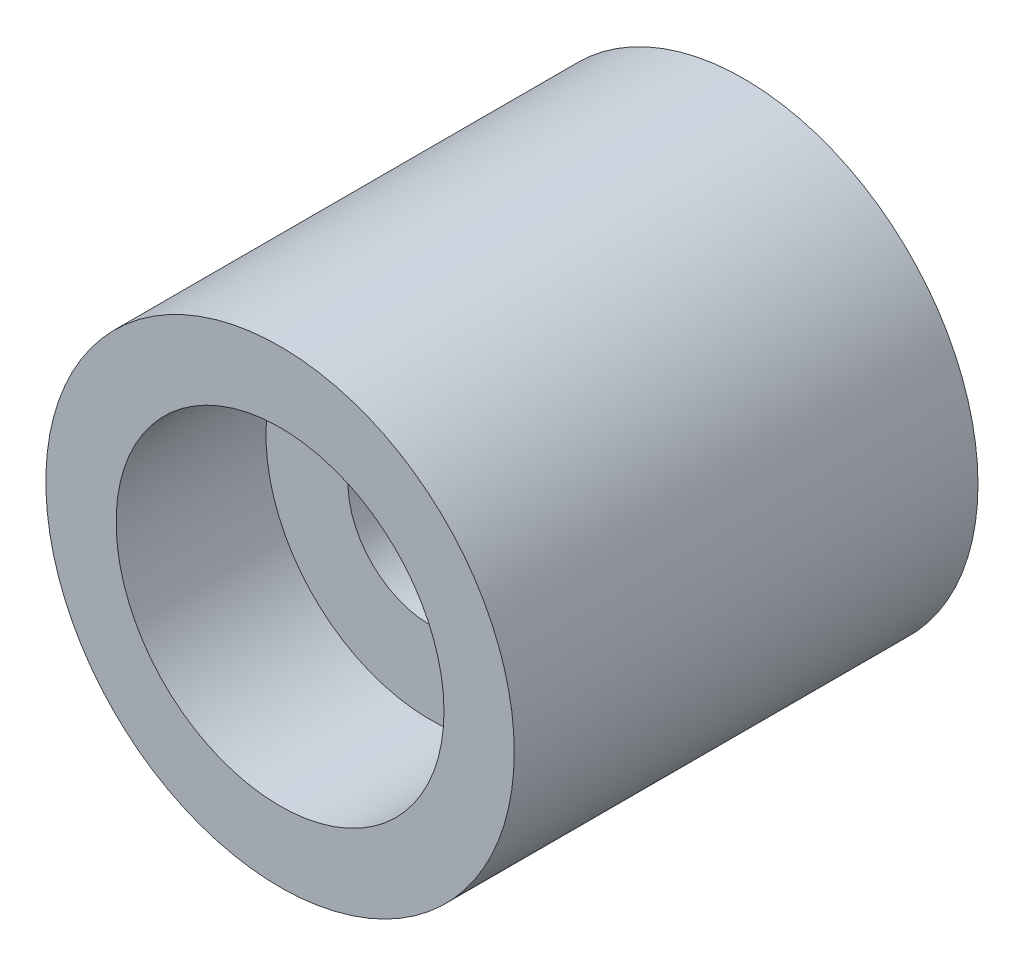
ISO-10303-21;
HEADER;
FILE_DESCRIPTION(('STEP AP214'),'2;1');
FILE_NAME('part.step','',(''),(''),'','','');
FILE_SCHEMA(('AUTOMOTIVE_DESIGN { 1 0 10303 214 1 1 1 1 }'));
ENDSEC;
DATA;
#1=APPLICATION_CONTEXT('core data for automotive mechanical design processes');
#2=APPLICATION_PROTOCOL_DEFINITION('international standard','automotive_design',2000,#1);
#3=PRODUCT_CONTEXT('',#1,'mechanical');
#4=PRODUCT('Part','Part','',(#3));
#5=PRODUCT_RELATED_PRODUCT_CATEGORY('part','',(#4));
#6=PRODUCT_DEFINITION_FORMATION('','',#4);
#7=PRODUCT_DEFINITION_CONTEXT('part definition',#1,'design');
#8=PRODUCT_DEFINITION('design','',#6,#7);
#9=PRODUCT_DEFINITION_SHAPE('','',#8);
#10=(LENGTH_UNIT() NAMED_UNIT(*) SI_UNIT(.MILLI.,.METRE.));
#11=(NAMED_UNIT(*) PLANE_ANGLE_UNIT() SI_UNIT($,.RADIAN.));
#12=(NAMED_UNIT(*) SI_UNIT($,.STERADIAN.) SOLID_ANGLE_UNIT());
#13=UNCERTAINTY_MEASURE_WITH_UNIT(LENGTH_MEASURE(1.E-05),#10,'distance_accuracy_value','');
#14=(GEOMETRIC_REPRESENTATION_CONTEXT(3) GLOBAL_UNCERTAINTY_ASSIGNED_CONTEXT((#13)) GLOBAL_UNIT_ASSIGNED_CONTEXT((#10,
#11,#12)) REPRESENTATION_CONTEXT('',''));
#15=CARTESIAN_POINT('',(0.,0.,0.));
#16=DIRECTION('',(0.,0.,1.));
#17=DIRECTION('',(1.,0.,0.));
#18=AXIS2_PLACEMENT_3D('',#15,#16,#17);
#19=CARTESIAN_POINT('',(-1.75,0.,1.75));
#20=DIRECTION('',(0.,0.,-1.));
#21=DIRECTION('',(1.,0.,0.));
#22=AXIS2_PLACEMENT_3D('',#19,#20,#21);
#23=PLANE('',#22);
#24=CARTESIAN_POINT('',(0.,0.,1.75));
#25=DIRECTION('',(0.,0.,1.));
#26=DIRECTION('',(1.,0.,0.));
#27=AXIS2_PLACEMENT_3D('',#24,#25,#26);
#28=CIRCLE('',#27,3.5);
#29=CARTESIAN_POINT('',(3.5,0.,1.75));
#30=VERTEX_POINT('',#29);
#31=EDGE_CURVE('E67',#30,#30,#28,.T.);
#32=ORIENTED_EDGE('',*,*,#31,.T.);
#33=EDGE_LOOP('',(#32));
#34=FACE_BOUND('',#33,.T.);
#35=CARTESIAN_POINT('',(0.,0.,1.75));
#36=DIRECTION('',(0.,0.,1.));
#37=DIRECTION('',(1.,0.,0.));
#38=AXIS2_PLACEMENT_3D('',#35,#36,#37);
#39=CIRCLE('',#38,1.75);
#40=CARTESIAN_POINT('',(1.75,0.,1.75));
#41=VERTEX_POINT('',#40);
#42=EDGE_CURVE('E10',#41,#41,#39,.T.);
#43=ORIENTED_EDGE('',*,*,#42,.F.);
#44=EDGE_LOOP('',(#43));
#45=FACE_BOUND('',#44,.T.);
#46=ADVANCED_FACE('F39',(#34,#45),#23,.F.);
#47=CARTESIAN_POINT('',(0.,0.,0.));
#48=DIRECTION('',(0.,0.,-1.));
#49=DIRECTION('',(1.,0.,0.));
#50=AXIS2_PLACEMENT_3D('',#47,#48,#49);
#51=CYLINDRICAL_SURFACE('',#50,1.75);
#52=ORIENTED_EDGE('',*,*,#42,.T.);
#53=EDGE_LOOP('',(#52));
#54=FACE_BOUND('',#53,.T.);
#55=CARTESIAN_POINT('',(0.,0.,-1.75));
#56=DIRECTION('',(0.,0.,1.));
#57=DIRECTION('',(1.,0.,0.));
#58=AXIS2_PLACEMENT_3D('',#55,#56,#57);
#59=CIRCLE('',#58,1.75);
#60=CARTESIAN_POINT('',(1.75,0.,-1.75));
#61=VERTEX_POINT('',#60);
#62=EDGE_CURVE('E45',#61,#61,#59,.T.);
#63=ORIENTED_EDGE('',*,*,#62,.F.);
#64=EDGE_LOOP('',(#63));
#65=FACE_BOUND('',#64,.T.);
#66=ADVANCED_FACE('F85',(#54,#65),#51,.F.);
#67=CARTESIAN_POINT('',(-3.5,0.,-1.75));
#68=DIRECTION('',(0.,0.,1.));
#69=DIRECTION('',(-1.,0.,0.));
#70=AXIS2_PLACEMENT_3D('',#67,#68,#69);
#71=PLANE('',#70);
#72=ORIENTED_EDGE('',*,*,#62,.T.);
#73=EDGE_LOOP('',(#72));
#74=FACE_BOUND('',#73,.T.);
#75=CARTESIAN_POINT('',(0.,0.,-1.75));
#76=DIRECTION('',(0.,0.,1.));
#77=DIRECTION('',(1.,0.,0.));
#78=AXIS2_PLACEMENT_3D('',#75,#76,#77);
#79=CIRCLE('',#78,3.5);
#80=CARTESIAN_POINT('',(3.5,0.,-1.75));
#81=VERTEX_POINT('',#80);
#82=EDGE_CURVE('E49',#81,#81,#79,.T.);
#83=ORIENTED_EDGE('',*,*,#82,.F.);
#84=EDGE_LOOP('',(#83));
#85=FACE_BOUND('',#84,.T.);
#86=ADVANCED_FACE('F89',(#74,#85),#71,.F.);
#87=CARTESIAN_POINT('',(0.,0.,0.));
#88=DIRECTION('',(0.,0.,-1.));
#89=DIRECTION('',(1.,0.,0.));
#90=AXIS2_PLACEMENT_3D('',#87,#88,#89);
#91=CYLINDRICAL_SURFACE('',#90,3.5);
#92=ORIENTED_EDGE('',*,*,#82,.T.);
#93=EDGE_LOOP('',(#92));
#94=FACE_BOUND('',#93,.T.);
#95=CARTESIAN_POINT('',(0.,0.,-4.95));
#96=DIRECTION('',(0.,0.,1.));
#97=DIRECTION('',(1.,0.,0.));
#98=AXIS2_PLACEMENT_3D('',#95,#96,#97);
#99=CIRCLE('',#98,3.5);
#100=CARTESIAN_POINT('',(3.5,0.,-4.95));
#101=VERTEX_POINT('',#100);
#102=EDGE_CURVE('E53',#101,#101,#99,.T.);
#103=ORIENTED_EDGE('',*,*,#102,.F.);
#104=EDGE_LOOP('',(#103));
#105=FACE_BOUND('',#104,.T.);
#106=ADVANCED_FACE('F93',(#94,#105),#91,.F.);
#107=CARTESIAN_POINT('',(-5.,0.,-4.94999999999999));
#108=DIRECTION('',(0.,0.,1.));
#109=DIRECTION('',(-1.,0.,0.));
#110=AXIS2_PLACEMENT_3D('',#107,#108,#109);
#111=PLANE('',#110);
#112=ORIENTED_EDGE('',*,*,#102,.T.);
#113=EDGE_LOOP('',(#112));
#114=FACE_BOUND('',#113,.T.);
#115=CARTESIAN_POINT('',(0.,0.,-4.94999999999999));
#116=DIRECTION('',(0.,0.,1.));
#117=DIRECTION('',(1.,0.,0.));
#118=AXIS2_PLACEMENT_3D('',#115,#116,#117);
#119=CIRCLE('',#118,5.);
#120=CARTESIAN_POINT('',(5.,0.,-4.94999999999999));
#121=VERTEX_POINT('',#120);
#122=EDGE_CURVE('E58',#121,#121,#119,.T.);
#123=ORIENTED_EDGE('',*,*,#122,.F.);
#124=EDGE_LOOP('',(#123));
#125=FACE_BOUND('',#124,.T.);
#126=ADVANCED_FACE('F99',(#114,#125),#111,.F.);
#127=CARTESIAN_POINT('',(0.,0.,0.));
#128=DIRECTION('',(0.,0.,-1.));
#129=DIRECTION('',(1.,0.,0.));
#130=AXIS2_PLACEMENT_3D('',#127,#128,#129);
#131=CYLINDRICAL_SURFACE('',#130,5.);
#132=ORIENTED_EDGE('',*,*,#122,.T.);
#133=EDGE_LOOP('',(#132));
#134=FACE_BOUND('',#133,.T.);
#135=CARTESIAN_POINT('',(0.,0.,4.94999999999999));
#136=DIRECTION('',(0.,0.,1.));
#137=DIRECTION('',(1.,0.,0.));
#138=AXIS2_PLACEMENT_3D('',#135,#136,#137);
#139=CIRCLE('',#138,5.);
#140=CARTESIAN_POINT('',(5.,0.,4.94999999999999));
#141=VERTEX_POINT('',#140);
#142=EDGE_CURVE('E61',#141,#141,#139,.T.);
#143=ORIENTED_EDGE('',*,*,#142,.F.);
#144=EDGE_LOOP('',(#143));
#145=FACE_BOUND('',#144,.T.);
#146=ADVANCED_FACE('F81',(#134,#145),#131,.T.);
#147=CARTESIAN_POINT('',(-3.5,0.,4.94999999999999));
#148=DIRECTION('',(0.,0.,-1.));
#149=DIRECTION('',(1.,0.,0.));
#150=AXIS2_PLACEMENT_3D('',#147,#148,#149);
#151=PLANE('',#150);
#152=ORIENTED_EDGE('',*,*,#142,.T.);
#153=EDGE_LOOP('',(#152));
#154=FACE_BOUND('',#153,.T.);
#155=CARTESIAN_POINT('',(0.,0.,4.95));
#156=DIRECTION('',(0.,0.,1.));
#157=DIRECTION('',(1.,0.,0.));
#158=AXIS2_PLACEMENT_3D('',#155,#156,#157);
#159=CIRCLE('',#158,3.5);
#160=CARTESIAN_POINT('',(3.5,0.,4.95));
#161=VERTEX_POINT('',#160);
#162=EDGE_CURVE('E64',#161,#161,#159,.T.);
#163=ORIENTED_EDGE('',*,*,#162,.F.);
#164=EDGE_LOOP('',(#163));
#165=FACE_BOUND('',#164,.T.);
#166=ADVANCED_FACE('F75',(#154,#165),#151,.F.);
#167=CARTESIAN_POINT('',(0.,0.,0.));
#168=DIRECTION('',(0.,0.,-1.));
#169=DIRECTION('',(1.,0.,0.));
#170=AXIS2_PLACEMENT_3D('',#167,#168,#169);
#171=CYLINDRICAL_SURFACE('',#170,3.5);
#172=ORIENTED_EDGE('',*,*,#162,.T.);
#173=EDGE_LOOP('',(#172));
#174=FACE_BOUND('',#173,.T.);
#175=ORIENTED_EDGE('',*,*,#31,.F.);
#176=EDGE_LOOP('',(#175));
#177=FACE_BOUND('',#176,.T.);
#178=ADVANCED_FACE('F73',(#174,#177),#171,.F.);
#179=CLOSED_SHELL('',(#46,#66,#86,#106,#126,#146,#166,#178));
#180=MANIFOLD_SOLID_BREP('B2',#179);
#181=ADVANCED_BREP_SHAPE_REPRESENTATION('',(#18,#180),#14);
#182=SHAPE_DEFINITION_REPRESENTATION(#9,#181);
ENDSEC;
END-ISO-10303-21;
